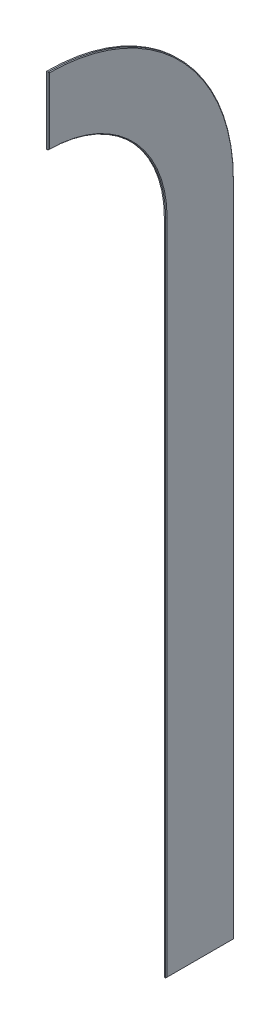
ISO-10303-21;
HEADER;
FILE_DESCRIPTION(('STEP AP214'),'2;1');
FILE_NAME('part.step','',(''),(''),'','','');
FILE_SCHEMA(('AUTOMOTIVE_DESIGN { 1 0 10303 214 1 1 1 1 }'));
ENDSEC;
DATA;
#1=APPLICATION_CONTEXT('core data for automotive mechanical design processes');
#2=APPLICATION_PROTOCOL_DEFINITION('international standard','automotive_design',2000,#1);
#3=PRODUCT_CONTEXT('',#1,'mechanical');
#4=PRODUCT('Part','Part','',(#3));
#5=PRODUCT_RELATED_PRODUCT_CATEGORY('part','',(#4));
#6=PRODUCT_DEFINITION_FORMATION('','',#4);
#7=PRODUCT_DEFINITION_CONTEXT('part definition',#1,'design');
#8=PRODUCT_DEFINITION('design','',#6,#7);
#9=PRODUCT_DEFINITION_SHAPE('','',#8);
#10=(LENGTH_UNIT() NAMED_UNIT(*) SI_UNIT(.MILLI.,.METRE.));
#11=(NAMED_UNIT(*) PLANE_ANGLE_UNIT() SI_UNIT($,.RADIAN.));
#12=(NAMED_UNIT(*) SI_UNIT($,.STERADIAN.) SOLID_ANGLE_UNIT());
#13=UNCERTAINTY_MEASURE_WITH_UNIT(LENGTH_MEASURE(1.E-05),#10,'distance_accuracy_value','');
#14=(GEOMETRIC_REPRESENTATION_CONTEXT(3) GLOBAL_UNCERTAINTY_ASSIGNED_CONTEXT((#13)) GLOBAL_UNIT_ASSIGNED_CONTEXT((#10,
#11,#12)) REPRESENTATION_CONTEXT('',''));
#15=CARTESIAN_POINT('',(0.,0.,0.));
#16=DIRECTION('',(0.,0.,1.));
#17=DIRECTION('',(1.,0.,0.));
#18=AXIS2_PLACEMENT_3D('',#15,#16,#17);
#19=CARTESIAN_POINT('',(823.,-991.,1915.));
#20=DIRECTION('',(1.,0.,0.));
#21=DIRECTION('',(0.,0.,1.));
#22=AXIS2_PLACEMENT_3D('',#19,#20,#21);
#23=PLANE('',#22);
#24=DIRECTION('',(2.250183010101E-10,1.,-2.2501824192284E-10));
#25=VECTOR('',#24,1.);
#26=CARTESIAN_POINT('',(823.,-984.3,766.7));
#27=LINE('',#26,#25);
#28=CARTESIAN_POINT('',(823.,-984.3,766.7));
#29=VERTEX_POINT('',#28);
#30=CARTESIAN_POINT('',(823.,-353.,766.699999148));
#31=VERTEX_POINT('',#30);
#32=EDGE_CURVE('E11',#29,#31,#27,.T.);
#33=ORIENTED_EDGE('',*,*,#32,.T.);
#34=CARTESIAN_POINT('',(823.,-352.9999999999,944.));
#35=DIRECTION('',(1.,0.,0.));
#36=DIRECTION('',(0.,-5.74586929513657E-13,-1.));
#37=AXIS2_PLACEMENT_3D('',#34,#35,#36);
#38=CIRCLE('',#37,177.3000008523);
#39=CARTESIAN_POINT('',(823.,-175.7013809917,943.2999999983));
#40=VERTEX_POINT('',#39);
#41=EDGE_CURVE('E29',#31,#40,#38,.T.);
#42=ORIENTED_EDGE('',*,*,#41,.T.);
#43=DIRECTION('',(3.261576416655E-10,-1.,2.458007209584E-11));
#44=VECTOR('',#43,1.);
#45=CARTESIAN_POINT('',(823.000000142067,-175.7013815599,943.2999999994));
#46=LINE('',#45,#44);
#47=CARTESIAN_POINT('',(823.000000162811,-239.3021551394,943.300000001));
#48=VERTEX_POINT('',#47);
#49=EDGE_CURVE('E147',#40,#48,#46,.T.);
#50=ORIENTED_EDGE('',*,*,#49,.T.);
#51=CARTESIAN_POINT('',(823.,-353.,944.));
#52=DIRECTION('',(-1.,0.,0.));
#53=DIRECTION('',(0.,0.999981048251953,-0.00615655235706077));
#54=AXIS2_PLACEMENT_3D('',#51,#52,#53);
#55=CIRCLE('',#54,113.6999990231);
#56=CARTESIAN_POINT('',(823.,-353.,830.300000977));
#57=VERTEX_POINT('',#56);
#58=EDGE_CURVE('E145',#48,#57,#55,.T.);
#59=ORIENTED_EDGE('',*,*,#58,.T.);
#60=DIRECTION('',(-2.57892824115E-10,-1.,-2.5789311862416E-10));
#61=VECTOR('',#60,1.);
#62=CARTESIAN_POINT('',(823.000000162808,-353.0000000002,830.300000163));
#63=LINE('',#62,#61);
#64=CARTESIAN_POINT('',(823.,-984.3,830.3));
#65=VERTEX_POINT('',#64);
#66=EDGE_CURVE('E81',#57,#65,#63,.T.);
#67=ORIENTED_EDGE('',*,*,#66,.T.);
#68=DIRECTION('',(0.,0.,-1.));
#69=VECTOR('',#68,1.);
#70=CARTESIAN_POINT('',(823.,-984.3,830.3));
#71=LINE('',#70,#69);
#72=EDGE_CURVE('E74',#65,#29,#71,.T.);
#73=ORIENTED_EDGE('',*,*,#72,.T.);
#74=EDGE_LOOP('',(#33,#42,#50,#59,#67,#73));
#75=FACE_BOUND('',#74,.T.);
#76=ADVANCED_FACE('F17',(#75),#23,.T.);
#77=CARTESIAN_POINT('',(822.65,-984.65,798.5));
#78=DIRECTION('',(0.707106781186548,-0.707106781186548,0.));
#79=DIRECTION('',(0.,0.,-1.));
#80=AXIS2_PLACEMENT_3D('',#77,#78,#79);
#81=PLANE('',#80);
#82=DIRECTION('',(0.577350269189626,0.577350269189626,0.577350269189626));
#83=VECTOR('',#82,1.);
#84=CARTESIAN_POINT('',(822.3,-985.,766.));
#85=LINE('',#84,#83);
#86=CARTESIAN_POINT('',(822.3,-985.,766.));
#87=VERTEX_POINT('',#86);
#88=EDGE_CURVE('E120',#87,#29,#85,.T.);
#89=ORIENTED_EDGE('',*,*,#88,.T.);
#90=ORIENTED_EDGE('',*,*,#72,.F.);
#91=DIRECTION('',(0.577350269189693,0.577350269189693,-0.577350269189492));
#92=VECTOR('',#91,1.);
#93=CARTESIAN_POINT('',(822.3,-985.,831.));
#94=LINE('',#93,#92);
#95=CARTESIAN_POINT('',(822.3,-985.,831.));
#96=VERTEX_POINT('',#95);
#97=EDGE_CURVE('E126',#96,#65,#94,.T.);
#98=ORIENTED_EDGE('',*,*,#97,.F.);
#99=DIRECTION('',(0.,0.,-1.));
#100=VECTOR('',#99,1.);
#101=CARTESIAN_POINT('',(822.3,-985.,831.));
#102=LINE('',#101,#100);
#103=EDGE_CURVE('E165',#96,#87,#102,.T.);
#104=ORIENTED_EDGE('',*,*,#103,.T.);
#105=EDGE_LOOP('',(#89,#90,#98,#104));
#106=FACE_BOUND('',#105,.T.);
#107=ADVANCED_FACE('F203',(#106),#81,.T.);
#108=CARTESIAN_POINT('',(823.,-985.,831.));
#109=DIRECTION('',(0.,-1.,0.));
#110=DIRECTION('',(1.,0.,0.));
#111=AXIS2_PLACEMENT_3D('',#108,#109,#110);
#112=PLANE('',#111);
#113=DIRECTION('',(-1.,0.,0.));
#114=VECTOR('',#113,1.);
#115=CARTESIAN_POINT('',(822.3,-985.,831.));
#116=LINE('',#115,#114);
#117=CARTESIAN_POINT('',(821.,-985.,831.));
#118=VERTEX_POINT('',#117);
#119=EDGE_CURVE('E141',#96,#118,#116,.T.);
#120=ORIENTED_EDGE('',*,*,#119,.T.);
#121=DIRECTION('',(0.,0.,-1.));
#122=VECTOR('',#121,1.);
#123=CARTESIAN_POINT('',(821.,-985.,831.));
#124=LINE('',#123,#122);
#125=CARTESIAN_POINT('',(821.,-985.,766.));
#126=VERTEX_POINT('',#125);
#127=EDGE_CURVE('E138',#118,#126,#124,.T.);
#128=ORIENTED_EDGE('',*,*,#127,.T.);
#129=DIRECTION('',(-1.,0.,0.));
#130=VECTOR('',#129,1.);
#131=CARTESIAN_POINT('',(822.3,-985.,766.));
#132=LINE('',#131,#130);
#133=EDGE_CURVE('E142',#87,#126,#132,.T.);
#134=ORIENTED_EDGE('',*,*,#133,.F.);
#135=ORIENTED_EDGE('',*,*,#103,.F.);
#136=EDGE_LOOP('',(#120,#128,#134,#135));
#137=FACE_BOUND('',#136,.T.);
#138=ADVANCED_FACE('F185',(#137),#112,.T.);
#139=CARTESIAN_POINT('',(823.,-985.,766.));
#140=DIRECTION('',(0.,0.,-1.));
#141=DIRECTION('',(0.,1.,0.));
#142=AXIS2_PLACEMENT_3D('',#139,#140,#141);
#143=PLANE('',#142);
#144=ORIENTED_EDGE('',*,*,#133,.T.);
#145=DIRECTION('',(0.,1.,0.));
#146=VECTOR('',#145,1.);
#147=CARTESIAN_POINT('',(821.,-985.,766.));
#148=LINE('',#147,#146);
#149=CARTESIAN_POINT('',(821.,-353.,766.));
#150=VERTEX_POINT('',#149);
#151=EDGE_CURVE('E106',#126,#150,#148,.T.);
#152=ORIENTED_EDGE('',*,*,#151,.T.);
#153=DIRECTION('',(-1.,4.84480791659349E-11,8.22777812318997E-08));
#154=VECTOR('',#153,1.);
#155=CARTESIAN_POINT('',(822.300000106961,-353.0000000001,765.999999893));
#156=LINE('',#155,#154);
#157=CARTESIAN_POINT('',(822.300000855747,-353.,766.));
#158=VERTEX_POINT('',#157);
#159=EDGE_CURVE('E101',#158,#150,#156,.T.);
#160=ORIENTED_EDGE('',*,*,#159,.F.);
#161=DIRECTION('',(1.692424474123E-10,1.,-1.6924234667854E-10));
#162=VECTOR('',#161,1.);
#163=CARTESIAN_POINT('',(822.3,-985.,766.));
#164=LINE('',#163,#162);
#165=EDGE_CURVE('E104',#87,#158,#164,.T.);
#166=ORIENTED_EDGE('',*,*,#165,.F.);
#167=EDGE_LOOP('',(#144,#152,#160,#166));
#168=FACE_BOUND('',#167,.T.);
#169=ADVANCED_FACE('F102',(#168),#143,.T.);
#170=CARTESIAN_POINT('',(822.65,-669.,766.35));
#171=DIRECTION('',(0.707106781186598,0.,-0.707106781186498));
#172=DIRECTION('',(0.,1.,0.));
#173=AXIS2_PLACEMENT_3D('',#170,#171,#172);
#174=PLANE('',#173);
#175=ORIENTED_EDGE('',*,*,#88,.F.);
#176=ORIENTED_EDGE('',*,*,#165,.T.);
#177=DIRECTION('',(-0.707106816635647,2.07861864637907E-11,-0.707106745737447));
#178=VECTOR('',#177,1.);
#179=CARTESIAN_POINT('',(823.000000142054,-353.0000000001,766.699999858));
#180=LINE('',#179,#178);
#181=EDGE_CURVE('E112',#31,#158,#180,.T.);
#182=ORIENTED_EDGE('',*,*,#181,.F.);
#183=ORIENTED_EDGE('',*,*,#32,.F.);
#184=EDGE_LOOP('',(#175,#176,#182,#183));
#185=FACE_BOUND('',#184,.T.);
#186=ADVANCED_FACE('F119',(#185),#174,.T.);
#187=CARTESIAN_POINT('',(822.650000427024,-352.9999999999,944.));
#188=DIRECTION('',(-1.,0.,0.));
#189=DIRECTION('',(0.,1.,0.));
#190=AXIS2_PLACEMENT_3D('',#187,#188,#189);
#191=CONICAL_SURFACE('',#190,177.650000427,0.785398165801316);
#192=CARTESIAN_POINT('',(822.300000106971,-174.999999893,944.));
#193=CARTESIAN_POINT('',(822.378052714545,-175.078052501,943.9219473924));
#194=CARTESIAN_POINT('',(822.533974831406,-175.2340764125,943.7660251375));
#195=CARTESIAN_POINT('',(822.767306763331,-175.4678695663,943.5326931849));
#196=CARTESIAN_POINT('',(822.922496499443,-175.6235713175,943.3775036421));
#197=CARTESIAN_POINT('',(823.000000142067,-175.7013815599,943.2999999994));
#198=(BOUNDED_CURVE() B_SPLINE_CURVE(3,(#192,#193,#194,#195,#196,#197),.UNSPECIFIED.,.F.,
.F.) B_SPLINE_CURVE_WITH_KNOTS((4,1,1,4),(0.,0.3333333333333,0.6666666666667,1.),
.UNSPECIFIED.) CURVE() GEOMETRIC_REPRESENTATION_ITEM() RATIONAL_B_SPLINE_CURVE((1.,1.,1.,1.,1.,1.)) REPRESENTATION_ITEM(''));
#199=CARTESIAN_POINT('',(822.300000855747,-175.,944.));
#200=VERTEX_POINT('',#199);
#201=EDGE_CURVE('E21',#200,#40,#198,.T.);
#202=ORIENTED_EDGE('',*,*,#201,.T.);
#203=ORIENTED_EDGE('',*,*,#41,.F.);
#204=ORIENTED_EDGE('',*,*,#181,.T.);
#205=CARTESIAN_POINT('',(822.300000855747,-353.,944.));
#206=DIRECTION('',(1.,0.,0.));
#207=DIRECTION('',(0.,0.,-1.));
#208=AXIS2_PLACEMENT_3D('',#205,#206,#207);
#209=CIRCLE('',#208,178.);
#210=EDGE_CURVE('E108',#158,#200,#209,.T.);
#211=ORIENTED_EDGE('',*,*,#210,.T.);
#212=EDGE_LOOP('',(#202,#203,#204,#211));
#213=FACE_BOUND('',#212,.T.);
#214=ADVANCED_FACE('F113',(#213),#191,.T.);
#215=CARTESIAN_POINT('',(823.,-353.,944.));
#216=DIRECTION('',(1.,0.,0.));
#217=DIRECTION('',(0.,1.,0.));
#218=AXIS2_PLACEMENT_3D('',#215,#216,#217);
#219=CYLINDRICAL_SURFACE('',#218,178.);
#220=ORIENTED_EDGE('',*,*,#159,.T.);
#221=CARTESIAN_POINT('',(821.,-353.,944.));
#222=DIRECTION('',(1.,0.,0.));
#223=DIRECTION('',(0.,0.,-1.));
#224=AXIS2_PLACEMENT_3D('',#221,#222,#223);
#225=CIRCLE('',#224,178.);
#226=CARTESIAN_POINT('',(821.,-175.,944.));
#227=VERTEX_POINT('',#226);
#228=EDGE_CURVE('E109',#150,#227,#225,.T.);
#229=ORIENTED_EDGE('',*,*,#228,.T.);
#230=DIRECTION('',(-1.,-8.22854769550297E-08,0.));
#231=VECTOR('',#230,1.);
#232=CARTESIAN_POINT('',(822.300000106971,-174.999999893,944.));
#233=LINE('',#232,#231);
#234=EDGE_CURVE('E95',#200,#227,#233,.T.);
#235=ORIENTED_EDGE('',*,*,#234,.F.);
#236=ORIENTED_EDGE('',*,*,#210,.F.);
#237=EDGE_LOOP('',(#220,#229,#235,#236));
#238=FACE_BOUND('',#237,.T.);
#239=ADVANCED_FACE('F122',(#238),#219,.T.);
#240=CARTESIAN_POINT('',(823.,-175.,944.));
#241=DIRECTION('',(0.,0.,1.));
#242=DIRECTION('',(1.,0.,0.));
#243=AXIS2_PLACEMENT_3D('',#240,#241,#242);
#244=PLANE('',#243);
#245=ORIENTED_EDGE('',*,*,#234,.T.);
#246=DIRECTION('',(0.,-1.,0.));
#247=VECTOR('',#246,1.);
#248=CARTESIAN_POINT('',(821.,-175.,944.));
#249=LINE('',#248,#247);
#250=CARTESIAN_POINT('',(821.,-240.,944.));
#251=VERTEX_POINT('',#250);
#252=EDGE_CURVE('E159',#227,#251,#249,.T.);
#253=ORIENTED_EDGE('',*,*,#252,.T.);
#254=DIRECTION('',(-1.,9.33514019896396E-08,0.));
#255=VECTOR('',#254,1.);
#256=CARTESIAN_POINT('',(822.300000121357,-240.0000001214,944.));
#257=LINE('',#256,#255);
#258=CARTESIAN_POINT('',(822.300000121357,-240.0000001214,944.));
#259=VERTEX_POINT('',#258);
#260=EDGE_CURVE('E133',#259,#251,#257,.T.);
#261=ORIENTED_EDGE('',*,*,#260,.F.);
#262=DIRECTION('',(2.213128544441E-10,-1.,0.));
#263=VECTOR('',#262,1.);
#264=CARTESIAN_POINT('',(822.300000106971,-174.999999893,944.));
#265=LINE('',#264,#263);
#266=EDGE_CURVE('E156',#200,#259,#265,.T.);
#267=ORIENTED_EDGE('',*,*,#266,.F.);
#268=EDGE_LOOP('',(#245,#253,#261,#267));
#269=FACE_BOUND('',#268,.T.);
#270=ADVANCED_FACE('F193',(#269),#244,.T.);
#271=CARTESIAN_POINT('',(822.65,-207.5010840812,943.65));
#272=DIRECTION('',(0.707106781186598,0.,0.707106781186498));
#273=DIRECTION('',(0.,1.,0.));
#274=AXIS2_PLACEMENT_3D('',#271,#272,#273);
#275=PLANE('',#274);
#276=ORIENTED_EDGE('',*,*,#201,.F.);
#277=ORIENTED_EDGE('',*,*,#266,.T.);
#278=CARTESIAN_POINT('',(822.300000121357,-240.0000001214,944.));
#279=CARTESIAN_POINT('',(822.377348309112,-239.9226519343,943.9226518122));
#280=CARTESIAN_POINT('',(822.532331058244,-239.7678290254,943.767668907));
#281=CARTESIAN_POINT('',(822.765660976597,-239.5352160553,943.5343389631));
#282=CARTESIAN_POINT('',(822.921791088292,-239.3798841881,943.3782090755));
#283=CARTESIAN_POINT('',(823.000000162811,-239.3021551394,943.300000001));
#284=(BOUNDED_CURVE() B_SPLINE_CURVE(3,(#278,#279,#280,#281,#282,#283),.UNSPECIFIED.,.F.,
.F.) B_SPLINE_CURVE_WITH_KNOTS((4,1,1,4),(0.,0.3333333333333,0.6666666666667,1.),
.UNSPECIFIED.) CURVE() GEOMETRIC_REPRESENTATION_ITEM() RATIONAL_B_SPLINE_CURVE((1.,1.,1.,1.,1.,1.)) REPRESENTATION_ITEM(''));
#285=EDGE_CURVE('E160',#259,#48,#284,.T.);
#286=ORIENTED_EDGE('',*,*,#285,.T.);
#287=ORIENTED_EDGE('',*,*,#49,.F.);
#288=EDGE_LOOP('',(#276,#277,#286,#287));
#289=FACE_BOUND('',#288,.T.);
#290=ADVANCED_FACE('F202',(#289),#275,.T.);
#291=CARTESIAN_POINT('',(822.650000486925,-353.,944.));
#292=DIRECTION('',(1.,0.,0.));
#293=DIRECTION('',(0.,1.,0.));
#294=AXIS2_PLACEMENT_3D('',#291,#292,#293);
#295=CONICAL_SURFACE('',#294,113.3499995131,0.785398159101521);
#296=ORIENTED_EDGE('',*,*,#285,.F.);
#297=CARTESIAN_POINT('',(822.300000970844,-353.,944.));
#298=DIRECTION('',(-1.,0.,0.));
#299=DIRECTION('',(0.,1.,0.));
#300=AXIS2_PLACEMENT_3D('',#297,#298,#299);
#301=CIRCLE('',#300,113.);
#302=CARTESIAN_POINT('',(822.300000970844,-353.,831.));
#303=VERTEX_POINT('',#302);
#304=EDGE_CURVE('E162',#259,#303,#301,.T.);
#305=ORIENTED_EDGE('',*,*,#304,.T.);
#306=DIRECTION('',(-0.707106823061296,5.661668016226E-11,0.707106739311796));
#307=VECTOR('',#306,1.);
#308=CARTESIAN_POINT('',(823.000000162808,-353.0000000002,830.300000163));
#309=LINE('',#308,#307);
#310=EDGE_CURVE('E132',#57,#303,#309,.T.);
#311=ORIENTED_EDGE('',*,*,#310,.F.);
#312=ORIENTED_EDGE('',*,*,#58,.F.);
#313=EDGE_LOOP('',(#296,#305,#311,#312));
#314=FACE_BOUND('',#313,.T.);
#315=ADVANCED_FACE('F200',(#314),#295,.F.);
#316=CARTESIAN_POINT('',(822.65,-636.5,830.65));
#317=DIRECTION('',(0.707106781186598,0.,0.707106781186498));
#318=DIRECTION('',(0.,1.,0.));
#319=AXIS2_PLACEMENT_3D('',#316,#317,#318);
#320=PLANE('',#319);
#321=ORIENTED_EDGE('',*,*,#310,.T.);
#322=DIRECTION('',(-1.920159298792E-10,-1.,-1.9201628814256E-10));
#323=VECTOR('',#322,1.);
#324=CARTESIAN_POINT('',(822.300000121354,-353.0000000002,831.000000121));
#325=LINE('',#324,#323);
#326=EDGE_CURVE('E128',#303,#96,#325,.T.);
#327=ORIENTED_EDGE('',*,*,#326,.T.);
#328=ORIENTED_EDGE('',*,*,#97,.T.);
#329=ORIENTED_EDGE('',*,*,#66,.F.);
#330=EDGE_LOOP('',(#321,#327,#328,#329));
#331=FACE_BOUND('',#330,.T.);
#332=ADVANCED_FACE('F204',(#331),#320,.T.);
#333=CARTESIAN_POINT('',(823.,-353.,831.));
#334=DIRECTION('',(0.,0.,1.));
#335=DIRECTION('',(1.,0.,0.));
#336=AXIS2_PLACEMENT_3D('',#333,#334,#335);
#337=PLANE('',#336);
#338=DIRECTION('',(-1.,1.26192378090994E-10,-9.33494780588996E-08));
#339=VECTOR('',#338,1.);
#340=CARTESIAN_POINT('',(822.300000121354,-353.0000000002,831.000000121));
#341=LINE('',#340,#339);
#342=CARTESIAN_POINT('',(821.,-353.,831.));
#343=VERTEX_POINT('',#342);
#344=EDGE_CURVE('E129',#303,#343,#341,.T.);
#345=ORIENTED_EDGE('',*,*,#344,.T.);
#346=DIRECTION('',(0.,1.,0.));
#347=VECTOR('',#346,1.);
#348=CARTESIAN_POINT('',(821.,-985.,831.));
#349=LINE('',#348,#347);
#350=EDGE_CURVE('E136',#118,#343,#349,.T.);
#351=ORIENTED_EDGE('',*,*,#350,.F.);
#352=ORIENTED_EDGE('',*,*,#119,.F.);
#353=ORIENTED_EDGE('',*,*,#326,.F.);
#354=EDGE_LOOP('',(#345,#351,#352,#353));
#355=FACE_BOUND('',#354,.T.);
#356=ADVANCED_FACE('F206',(#355),#337,.T.);
#357=CARTESIAN_POINT('',(821.,-991.,1915.));
#358=DIRECTION('',(1.,0.,0.));
#359=DIRECTION('',(0.,0.,1.));
#360=AXIS2_PLACEMENT_3D('',#357,#358,#359);
#361=PLANE('',#360);
#362=ORIENTED_EDGE('',*,*,#252,.F.);
#363=ORIENTED_EDGE('',*,*,#228,.F.);
#364=ORIENTED_EDGE('',*,*,#151,.F.);
#365=ORIENTED_EDGE('',*,*,#127,.F.);
#366=ORIENTED_EDGE('',*,*,#350,.T.);
#367=CARTESIAN_POINT('',(821.,-353.,944.));
#368=DIRECTION('',(-1.,0.,0.));
#369=DIRECTION('',(0.,1.,0.));
#370=AXIS2_PLACEMENT_3D('',#367,#368,#369);
#371=CIRCLE('',#370,113.);
#372=EDGE_CURVE('E137',#251,#343,#371,.T.);
#373=ORIENTED_EDGE('',*,*,#372,.F.);
#374=EDGE_LOOP('',(#362,#363,#364,#365,#366,#373));
#375=FACE_BOUND('',#374,.T.);
#376=ADVANCED_FACE('F190',(#375),#361,.F.);
#377=CARTESIAN_POINT('',(823.,-353.,944.));
#378=DIRECTION('',(1.,0.,0.));
#379=DIRECTION('',(0.,1.,0.));
#380=AXIS2_PLACEMENT_3D('',#377,#378,#379);
#381=CYLINDRICAL_SURFACE('',#380,113.);
#382=ORIENTED_EDGE('',*,*,#260,.T.);
#383=ORIENTED_EDGE('',*,*,#372,.T.);
#384=ORIENTED_EDGE('',*,*,#344,.F.);
#385=ORIENTED_EDGE('',*,*,#304,.F.);
#386=EDGE_LOOP('',(#382,#383,#384,#385));
#387=FACE_BOUND('',#386,.T.);
#388=ADVANCED_FACE('F19',(#387),#381,.F.);
#389=CLOSED_SHELL('',(#76,#107,#138,#169,#186,#214,#239,#270,#290,#315,#332,#356,#376,#388));
#390=MANIFOLD_SOLID_BREP('B1',#389);
#391=ADVANCED_BREP_SHAPE_REPRESENTATION('',(#18,#390),#14);
#392=SHAPE_DEFINITION_REPRESENTATION(#9,#391);
ENDSEC;
END-ISO-10303-21;
